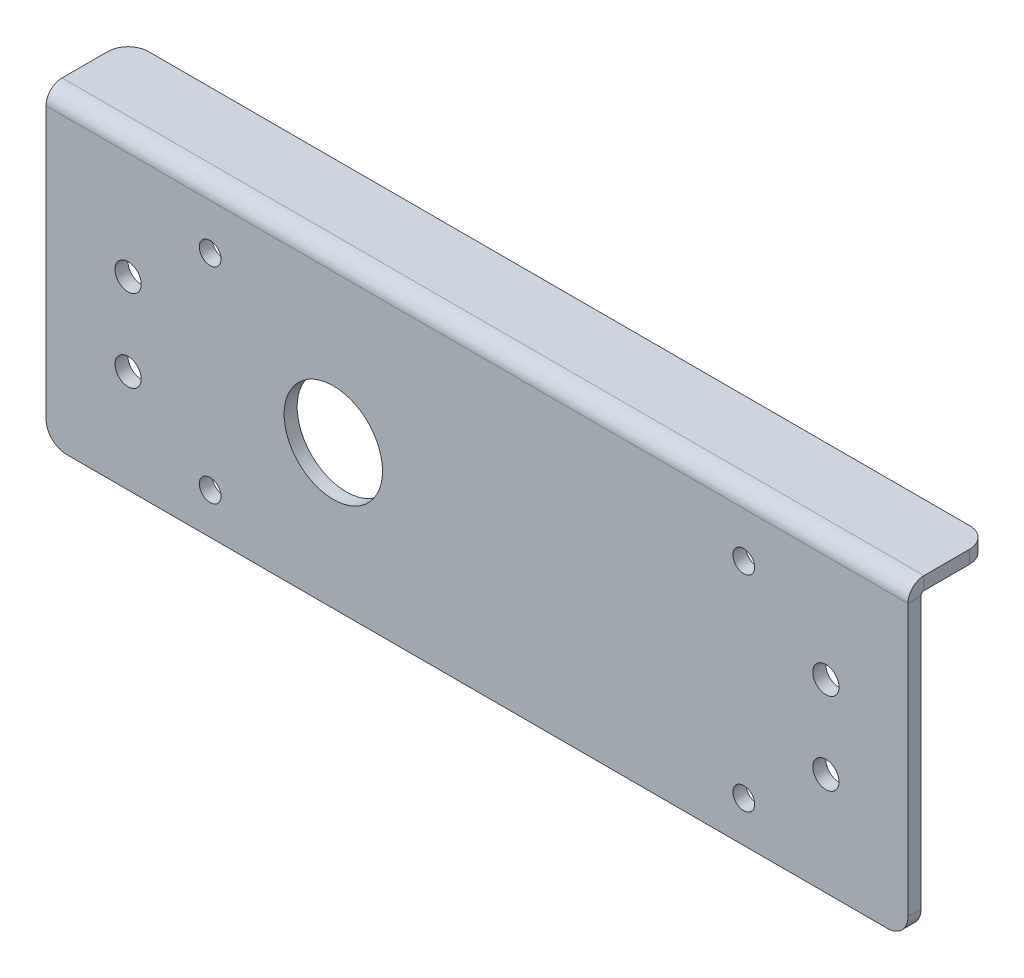
ISO-10303-21;
HEADER;
FILE_DESCRIPTION(('STEP AP214'),'2;1');
FILE_NAME('part.step','',(''),(''),'','','');
FILE_SCHEMA(('AUTOMOTIVE_DESIGN { 1 0 10303 214 1 1 1 1 }'));
ENDSEC;
DATA;
#1=APPLICATION_CONTEXT('core data for automotive mechanical design processes');
#2=APPLICATION_PROTOCOL_DEFINITION('international standard','automotive_design',2000,#1);
#3=PRODUCT_CONTEXT('',#1,'mechanical');
#4=PRODUCT('Part','Part','',(#3));
#5=PRODUCT_RELATED_PRODUCT_CATEGORY('part','',(#4));
#6=PRODUCT_DEFINITION_FORMATION('','',#4);
#7=PRODUCT_DEFINITION_CONTEXT('part definition',#1,'design');
#8=PRODUCT_DEFINITION('design','',#6,#7);
#9=PRODUCT_DEFINITION_SHAPE('','',#8);
#10=(LENGTH_UNIT() NAMED_UNIT(*) SI_UNIT(.MILLI.,.METRE.));
#11=(NAMED_UNIT(*) PLANE_ANGLE_UNIT() SI_UNIT($,.RADIAN.));
#12=(NAMED_UNIT(*) SI_UNIT($,.STERADIAN.) SOLID_ANGLE_UNIT());
#13=UNCERTAINTY_MEASURE_WITH_UNIT(LENGTH_MEASURE(1.E-05),#10,'distance_accuracy_value','');
#14=(GEOMETRIC_REPRESENTATION_CONTEXT(3) GLOBAL_UNCERTAINTY_ASSIGNED_CONTEXT((#13)) GLOBAL_UNIT_ASSIGNED_CONTEXT((#10,
#11,#12)) REPRESENTATION_CONTEXT('',''));
#15=CARTESIAN_POINT('',(0.,0.,0.));
#16=DIRECTION('',(0.,0.,1.));
#17=DIRECTION('',(1.,0.,0.));
#18=AXIS2_PLACEMENT_3D('',#15,#16,#17);
#19=CARTESIAN_POINT('',(140.,40.,-3.175));
#20=DIRECTION('',(1.,0.,0.));
#21=DIRECTION('',(0.,0.,-1.));
#22=AXIS2_PLACEMENT_3D('',#19,#20,#21);
#23=PLANE('',#22);
#24=DIRECTION('',(0.,1.,0.));
#25=VECTOR('',#24,1.);
#26=CARTESIAN_POINT('',(140.,40.,0.));
#27=LINE('',#26,#25);
#28=CARTESIAN_POINT('',(140.,-30.,0.));
#29=VERTEX_POINT('',#28);
#30=CARTESIAN_POINT('',(140.,36.0884,0.));
#31=VERTEX_POINT('',#30);
#32=EDGE_CURVE('E227',#29,#31,#27,.T.);
#33=ORIENTED_EDGE('',*,*,#32,.F.);
#34=DIRECTION('',(0.,0.,1.));
#35=VECTOR('',#34,1.);
#36=CARTESIAN_POINT('',(140.,-30.,-3.175));
#37=LINE('',#36,#35);
#38=CARTESIAN_POINT('',(140.,-30.,-3.175));
#39=VERTEX_POINT('',#38);
#40=EDGE_CURVE('E13',#29,#39,#37,.F.);
#41=ORIENTED_EDGE('',*,*,#40,.T.);
#42=DIRECTION('',(0.,1.,0.));
#43=VECTOR('',#42,1.);
#44=CARTESIAN_POINT('',(140.,40.,-3.175));
#45=LINE('',#44,#43);
#46=CARTESIAN_POINT('',(140.,36.0884,-3.175));
#47=VERTEX_POINT('',#46);
#48=EDGE_CURVE('E229',#39,#47,#45,.T.);
#49=ORIENTED_EDGE('',*,*,#48,.T.);
#50=DIRECTION('',(0.,0.,1.));
#51=VECTOR('',#50,1.);
#52=CARTESIAN_POINT('',(140.,36.0884,-3.175));
#53=LINE('',#52,#51);
#54=EDGE_CURVE('E205',#47,#31,#53,.T.);
#55=ORIENTED_EDGE('',*,*,#54,.T.);
#56=EDGE_LOOP('',(#33,#41,#49,#55));
#57=FACE_BOUND('',#56,.T.);
#58=ADVANCED_FACE('F59',(#57),#23,.T.);
#59=CARTESIAN_POINT('',(0.,0.,-3.175));
#60=DIRECTION('',(0.,0.,1.));
#61=DIRECTION('',(1.,0.,0.));
#62=AXIS2_PLACEMENT_3D('',#59,#60,#61);
#63=PLANE('',#62);
#64=CARTESIAN_POINT('',(-30.,25.,-3.175));
#65=DIRECTION('',(0.,0.,1.));
#66=DIRECTION('',(1.,0.,0.));
#67=AXIS2_PLACEMENT_3D('',#64,#65,#66);
#68=CIRCLE('',#67,2.65);
#69=CARTESIAN_POINT('',(-27.35,25.,-3.175));
#70=VERTEX_POINT('',#69);
#71=EDGE_CURVE('E349',#70,#70,#68,.T.);
#72=ORIENTED_EDGE('',*,*,#71,.T.);
#73=EDGE_LOOP('',(#72));
#74=FACE_BOUND('',#73,.T.);
#75=CARTESIAN_POINT('',(-30.,-25.,-3.175));
#76=DIRECTION('',(0.,0.,1.));
#77=DIRECTION('',(1.,0.,0.));
#78=AXIS2_PLACEMENT_3D('',#75,#76,#77);
#79=CIRCLE('',#78,2.65);
#80=CARTESIAN_POINT('',(-27.35,-25.,-3.175));
#81=VERTEX_POINT('',#80);
#82=EDGE_CURVE('E343',#81,#81,#79,.T.);
#83=ORIENTED_EDGE('',*,*,#82,.T.);
#84=EDGE_LOOP('',(#83));
#85=FACE_BOUND('',#84,.T.);
#86=CARTESIAN_POINT('',(100.,-25.,-3.175));
#87=DIRECTION('',(0.,0.,1.));
#88=DIRECTION('',(1.,0.,0.));
#89=AXIS2_PLACEMENT_3D('',#86,#87,#88);
#90=CIRCLE('',#89,2.65);
#91=CARTESIAN_POINT('',(102.65,-25.,-3.175));
#92=VERTEX_POINT('',#91);
#93=EDGE_CURVE('E337',#92,#92,#90,.T.);
#94=ORIENTED_EDGE('',*,*,#93,.T.);
#95=EDGE_LOOP('',(#94));
#96=FACE_BOUND('',#95,.T.);
#97=CARTESIAN_POINT('',(100.,25.,-3.175));
#98=DIRECTION('',(0.,0.,1.));
#99=DIRECTION('',(1.,0.,0.));
#100=AXIS2_PLACEMENT_3D('',#97,#98,#99);
#101=CIRCLE('',#100,2.65);
#102=CARTESIAN_POINT('',(102.65,25.,-3.175));
#103=VERTEX_POINT('',#102);
#104=EDGE_CURVE('E331',#103,#103,#101,.T.);
#105=ORIENTED_EDGE('',*,*,#104,.T.);
#106=EDGE_LOOP('',(#105));
#107=FACE_BOUND('',#106,.T.);
#108=CARTESIAN_POINT('',(-50.,10.,-3.175));
#109=DIRECTION('',(0.,0.,1.));
#110=DIRECTION('',(1.,0.,0.));
#111=AXIS2_PLACEMENT_3D('',#108,#109,#110);
#112=CIRCLE('',#111,3.19999999999999);
#113=CARTESIAN_POINT('',(-46.8,10.,-3.175));
#114=VERTEX_POINT('',#113);
#115=EDGE_CURVE('E325',#114,#114,#112,.T.);
#116=ORIENTED_EDGE('',*,*,#115,.T.);
#117=EDGE_LOOP('',(#116));
#118=FACE_BOUND('',#117,.T.);
#119=CARTESIAN_POINT('',(-50.,-10.,-3.175));
#120=DIRECTION('',(0.,0.,1.));
#121=DIRECTION('',(1.,0.,0.));
#122=AXIS2_PLACEMENT_3D('',#119,#120,#121);
#123=CIRCLE('',#122,3.19999999999999);
#124=CARTESIAN_POINT('',(-46.8,-10.,-3.175));
#125=VERTEX_POINT('',#124);
#126=EDGE_CURVE('E319',#125,#125,#123,.T.);
#127=ORIENTED_EDGE('',*,*,#126,.T.);
#128=EDGE_LOOP('',(#127));
#129=FACE_BOUND('',#128,.T.);
#130=CARTESIAN_POINT('',(120.,-10.,-3.175));
#131=DIRECTION('',(0.,0.,1.));
#132=DIRECTION('',(1.,0.,0.));
#133=AXIS2_PLACEMENT_3D('',#130,#131,#132);
#134=CIRCLE('',#133,3.19999999999999);
#135=CARTESIAN_POINT('',(123.2,-10.,-3.175));
#136=VERTEX_POINT('',#135);
#137=EDGE_CURVE('E313',#136,#136,#134,.T.);
#138=ORIENTED_EDGE('',*,*,#137,.T.);
#139=EDGE_LOOP('',(#138));
#140=FACE_BOUND('',#139,.T.);
#141=CARTESIAN_POINT('',(120.,10.,-3.175));
#142=DIRECTION('',(0.,0.,1.));
#143=DIRECTION('',(1.,0.,0.));
#144=AXIS2_PLACEMENT_3D('',#141,#142,#143);
#145=CIRCLE('',#144,3.19999999999999);
#146=CARTESIAN_POINT('',(123.2,10.,-3.175));
#147=VERTEX_POINT('',#146);
#148=EDGE_CURVE('E202',#147,#147,#145,.T.);
#149=ORIENTED_EDGE('',*,*,#148,.T.);
#150=EDGE_LOOP('',(#149));
#151=FACE_BOUND('',#150,.T.);
#152=CARTESIAN_POINT('',(0.,0.,-3.175));
#153=DIRECTION('',(0.,0.,1.));
#154=DIRECTION('',(1.,0.,0.));
#155=AXIS2_PLACEMENT_3D('',#152,#153,#154);
#156=CIRCLE('',#155,11.9875);
#157=CARTESIAN_POINT('',(11.9875,0.,-3.175));
#158=VERTEX_POINT('',#157);
#159=EDGE_CURVE('E217',#158,#158,#156,.T.);
#160=ORIENTED_EDGE('',*,*,#159,.T.);
#161=EDGE_LOOP('',(#160));
#162=FACE_BOUND('',#161,.T.);
#163=DIRECTION('',(1.,0.,0.));
#164=VECTOR('',#163,1.);
#165=CARTESIAN_POINT('',(-70.,-35.,-3.175));
#166=LINE('',#165,#164);
#167=CARTESIAN_POINT('',(-65.,-35.,-3.175));
#168=VERTEX_POINT('',#167);
#169=CARTESIAN_POINT('',(135.,-35.,-3.175));
#170=VERTEX_POINT('',#169);
#171=EDGE_CURVE('E226',#168,#170,#166,.T.);
#172=ORIENTED_EDGE('',*,*,#171,.F.);
#173=CARTESIAN_POINT('',(-65.,-30.,-3.175));
#174=DIRECTION('',(0.,0.,1.));
#175=DIRECTION('',(1.,0.,0.));
#176=AXIS2_PLACEMENT_3D('',#173,#174,#175);
#177=CIRCLE('',#176,5.);
#178=CARTESIAN_POINT('',(-70.,-30.,-3.175));
#179=VERTEX_POINT('',#178);
#180=EDGE_CURVE('E67',#168,#179,#177,.F.);
#181=ORIENTED_EDGE('',*,*,#180,.T.);
#182=DIRECTION('',(0.,-1.,0.));
#183=VECTOR('',#182,1.);
#184=CARTESIAN_POINT('',(-70.,40.,-3.175));
#185=LINE('',#184,#183);
#186=CARTESIAN_POINT('',(-70.,36.0884,-3.175));
#187=VERTEX_POINT('',#186);
#188=EDGE_CURVE('E223',#187,#179,#185,.T.);
#189=ORIENTED_EDGE('',*,*,#188,.F.);
#190=DIRECTION('',(1.,0.,0.));
#191=VECTOR('',#190,1.);
#192=CARTESIAN_POINT('',(140.,36.0884,-3.175));
#193=LINE('',#192,#191);
#194=EDGE_CURVE('E209',#47,#187,#193,.F.);
#195=ORIENTED_EDGE('',*,*,#194,.F.);
#196=ORIENTED_EDGE('',*,*,#48,.F.);
#197=CARTESIAN_POINT('',(135.,-30.,-3.175));
#198=DIRECTION('',(0.,0.,1.));
#199=DIRECTION('',(1.,0.,0.));
#200=AXIS2_PLACEMENT_3D('',#197,#198,#199);
#201=CIRCLE('',#200,5.);
#202=EDGE_CURVE('E79',#39,#170,#201,.F.);
#203=ORIENTED_EDGE('',*,*,#202,.T.);
#204=EDGE_LOOP('',(#172,#181,#189,#195,#196,#203));
#205=FACE_BOUND('',#204,.T.);
#206=ADVANCED_FACE('F268',(#74,#85,#96,#107,#118,#129,#140,#151,#162,#205),#63,.F.);
#207=CARTESIAN_POINT('',(0.,0.,0.));
#208=DIRECTION('',(0.,0.,1.));
#209=DIRECTION('',(1.,0.,0.));
#210=AXIS2_PLACEMENT_3D('',#207,#208,#209);
#211=PLANE('',#210);
#212=CARTESIAN_POINT('',(-30.,25.,0.));
#213=DIRECTION('',(0.,0.,1.));
#214=DIRECTION('',(1.,0.,0.));
#215=AXIS2_PLACEMENT_3D('',#212,#213,#214);
#216=CIRCLE('',#215,2.65);
#217=CARTESIAN_POINT('',(-27.35,25.,0.));
#218=VERTEX_POINT('',#217);
#219=EDGE_CURVE('E352',#218,#218,#216,.T.);
#220=ORIENTED_EDGE('',*,*,#219,.F.);
#221=EDGE_LOOP('',(#220));
#222=FACE_BOUND('',#221,.T.);
#223=CARTESIAN_POINT('',(-30.,-25.,0.));
#224=DIRECTION('',(0.,0.,1.));
#225=DIRECTION('',(1.,0.,0.));
#226=AXIS2_PLACEMENT_3D('',#223,#224,#225);
#227=CIRCLE('',#226,2.65);
#228=CARTESIAN_POINT('',(-27.35,-25.,0.));
#229=VERTEX_POINT('',#228);
#230=EDGE_CURVE('E346',#229,#229,#227,.T.);
#231=ORIENTED_EDGE('',*,*,#230,.F.);
#232=EDGE_LOOP('',(#231));
#233=FACE_BOUND('',#232,.T.);
#234=CARTESIAN_POINT('',(100.,-25.,0.));
#235=DIRECTION('',(0.,0.,1.));
#236=DIRECTION('',(1.,0.,0.));
#237=AXIS2_PLACEMENT_3D('',#234,#235,#236);
#238=CIRCLE('',#237,2.65);
#239=CARTESIAN_POINT('',(102.65,-25.,0.));
#240=VERTEX_POINT('',#239);
#241=EDGE_CURVE('E340',#240,#240,#238,.T.);
#242=ORIENTED_EDGE('',*,*,#241,.F.);
#243=EDGE_LOOP('',(#242));
#244=FACE_BOUND('',#243,.T.);
#245=CARTESIAN_POINT('',(100.,25.,0.));
#246=DIRECTION('',(0.,0.,1.));
#247=DIRECTION('',(1.,0.,0.));
#248=AXIS2_PLACEMENT_3D('',#245,#246,#247);
#249=CIRCLE('',#248,2.65);
#250=CARTESIAN_POINT('',(102.65,25.,0.));
#251=VERTEX_POINT('',#250);
#252=EDGE_CURVE('E334',#251,#251,#249,.T.);
#253=ORIENTED_EDGE('',*,*,#252,.F.);
#254=EDGE_LOOP('',(#253));
#255=FACE_BOUND('',#254,.T.);
#256=CARTESIAN_POINT('',(-50.,10.,0.));
#257=DIRECTION('',(0.,0.,1.));
#258=DIRECTION('',(1.,0.,0.));
#259=AXIS2_PLACEMENT_3D('',#256,#257,#258);
#260=CIRCLE('',#259,3.19999999999999);
#261=CARTESIAN_POINT('',(-46.8,10.,0.));
#262=VERTEX_POINT('',#261);
#263=EDGE_CURVE('E328',#262,#262,#260,.T.);
#264=ORIENTED_EDGE('',*,*,#263,.F.);
#265=EDGE_LOOP('',(#264));
#266=FACE_BOUND('',#265,.T.);
#267=CARTESIAN_POINT('',(-50.,-10.,0.));
#268=DIRECTION('',(0.,0.,1.));
#269=DIRECTION('',(1.,0.,0.));
#270=AXIS2_PLACEMENT_3D('',#267,#268,#269);
#271=CIRCLE('',#270,3.19999999999999);
#272=CARTESIAN_POINT('',(-46.8,-10.,0.));
#273=VERTEX_POINT('',#272);
#274=EDGE_CURVE('E322',#273,#273,#271,.T.);
#275=ORIENTED_EDGE('',*,*,#274,.F.);
#276=EDGE_LOOP('',(#275));
#277=FACE_BOUND('',#276,.T.);
#278=CARTESIAN_POINT('',(120.,-10.,0.));
#279=DIRECTION('',(0.,0.,1.));
#280=DIRECTION('',(1.,0.,0.));
#281=AXIS2_PLACEMENT_3D('',#278,#279,#280);
#282=CIRCLE('',#281,3.19999999999998);
#283=CARTESIAN_POINT('',(123.2,-10.,0.));
#284=VERTEX_POINT('',#283);
#285=EDGE_CURVE('E316',#284,#284,#282,.T.);
#286=ORIENTED_EDGE('',*,*,#285,.F.);
#287=EDGE_LOOP('',(#286));
#288=FACE_BOUND('',#287,.T.);
#289=CARTESIAN_POINT('',(120.,10.,0.));
#290=DIRECTION('',(0.,0.,1.));
#291=DIRECTION('',(1.,0.,0.));
#292=AXIS2_PLACEMENT_3D('',#289,#290,#291);
#293=CIRCLE('',#292,3.19999999999998);
#294=CARTESIAN_POINT('',(123.2,10.,0.));
#295=VERTEX_POINT('',#294);
#296=EDGE_CURVE('E310',#295,#295,#293,.T.);
#297=ORIENTED_EDGE('',*,*,#296,.F.);
#298=EDGE_LOOP('',(#297));
#299=FACE_BOUND('',#298,.T.);
#300=CARTESIAN_POINT('',(0.,0.,0.));
#301=DIRECTION('',(0.,0.,1.));
#302=DIRECTION('',(1.,0.,0.));
#303=AXIS2_PLACEMENT_3D('',#300,#301,#302);
#304=CIRCLE('',#303,11.9875);
#305=CARTESIAN_POINT('',(11.9875,0.,0.));
#306=VERTEX_POINT('',#305);
#307=EDGE_CURVE('E215',#306,#306,#304,.T.);
#308=ORIENTED_EDGE('',*,*,#307,.F.);
#309=EDGE_LOOP('',(#308));
#310=FACE_BOUND('',#309,.T.);
#311=DIRECTION('',(0.,-1.,0.));
#312=VECTOR('',#311,1.);
#313=CARTESIAN_POINT('',(-70.,40.,0.));
#314=LINE('',#313,#312);
#315=CARTESIAN_POINT('',(-70.,36.0884,0.));
#316=VERTEX_POINT('',#315);
#317=CARTESIAN_POINT('',(-70.,-30.,0.));
#318=VERTEX_POINT('',#317);
#319=EDGE_CURVE('E220',#316,#318,#314,.T.);
#320=ORIENTED_EDGE('',*,*,#319,.T.);
#321=CARTESIAN_POINT('',(-65.,-30.,0.));
#322=DIRECTION('',(0.,0.,1.));
#323=DIRECTION('',(1.,0.,0.));
#324=AXIS2_PLACEMENT_3D('',#321,#322,#323);
#325=CIRCLE('',#324,5.);
#326=CARTESIAN_POINT('',(-65.,-35.,0.));
#327=VERTEX_POINT('',#326);
#328=EDGE_CURVE('E259',#318,#327,#325,.T.);
#329=ORIENTED_EDGE('',*,*,#328,.T.);
#330=DIRECTION('',(1.,0.,0.));
#331=VECTOR('',#330,1.);
#332=CARTESIAN_POINT('',(-70.,-35.,0.));
#333=LINE('',#332,#331);
#334=CARTESIAN_POINT('',(135.,-35.,0.));
#335=VERTEX_POINT('',#334);
#336=EDGE_CURVE('E234',#327,#335,#333,.T.);
#337=ORIENTED_EDGE('',*,*,#336,.T.);
#338=CARTESIAN_POINT('',(135.,-30.,0.));
#339=DIRECTION('',(0.,0.,1.));
#340=DIRECTION('',(1.,0.,0.));
#341=AXIS2_PLACEMENT_3D('',#338,#339,#340);
#342=CIRCLE('',#341,5.);
#343=EDGE_CURVE('E257',#335,#29,#342,.T.);
#344=ORIENTED_EDGE('',*,*,#343,.T.);
#345=ORIENTED_EDGE('',*,*,#32,.T.);
#346=DIRECTION('',(1.,0.,0.));
#347=VECTOR('',#346,1.);
#348=CARTESIAN_POINT('',(140.,36.0884,0.));
#349=LINE('',#348,#347);
#350=EDGE_CURVE('E156',#31,#316,#349,.F.);
#351=ORIENTED_EDGE('',*,*,#350,.T.);
#352=EDGE_LOOP('',(#320,#329,#337,#344,#345,#351));
#353=FACE_BOUND('',#352,.T.);
#354=ADVANCED_FACE('F280',(#222,#233,#244,#255,#266,#277,#288,#299,#310,#353),#211,.T.);
#355=CARTESIAN_POINT('',(-70.,40.,-3.175));
#356=DIRECTION('',(-1.,0.,0.));
#357=DIRECTION('',(0.,-1.,0.));
#358=AXIS2_PLACEMENT_3D('',#355,#356,#357);
#359=PLANE('',#358);
#360=ORIENTED_EDGE('',*,*,#188,.T.);
#361=DIRECTION('',(0.,0.,1.));
#362=VECTOR('',#361,1.);
#363=CARTESIAN_POINT('',(-70.,-30.,-3.175));
#364=LINE('',#363,#362);
#365=EDGE_CURVE('E254',#179,#318,#364,.T.);
#366=ORIENTED_EDGE('',*,*,#365,.T.);
#367=ORIENTED_EDGE('',*,*,#319,.F.);
#368=DIRECTION('',(0.,0.,1.));
#369=VECTOR('',#368,1.);
#370=CARTESIAN_POINT('',(-70.,36.0884,-3.175));
#371=LINE('',#370,#369);
#372=EDGE_CURVE('E212',#187,#316,#371,.T.);
#373=ORIENTED_EDGE('',*,*,#372,.F.);
#374=EDGE_LOOP('',(#360,#366,#367,#373));
#375=FACE_BOUND('',#374,.T.);
#376=ADVANCED_FACE('F275',(#375),#359,.T.);
#377=CARTESIAN_POINT('',(-70.,-35.,-3.175));
#378=DIRECTION('',(0.,-1.,0.));
#379=DIRECTION('',(0.,0.,-1.));
#380=AXIS2_PLACEMENT_3D('',#377,#378,#379);
#381=PLANE('',#380);
#382=ORIENTED_EDGE('',*,*,#336,.F.);
#383=DIRECTION('',(0.,0.,1.));
#384=VECTOR('',#383,1.);
#385=CARTESIAN_POINT('',(-65.,-35.,-3.175));
#386=LINE('',#385,#384);
#387=EDGE_CURVE('E264',#327,#168,#386,.F.);
#388=ORIENTED_EDGE('',*,*,#387,.T.);
#389=ORIENTED_EDGE('',*,*,#171,.T.);
#390=DIRECTION('',(0.,0.,1.));
#391=VECTOR('',#390,1.);
#392=CARTESIAN_POINT('',(135.,-35.,-3.175));
#393=LINE('',#392,#391);
#394=EDGE_CURVE('E261',#170,#335,#393,.T.);
#395=ORIENTED_EDGE('',*,*,#394,.T.);
#396=EDGE_LOOP('',(#382,#388,#389,#395));
#397=FACE_BOUND('',#396,.T.);
#398=ADVANCED_FACE('F282',(#397),#381,.T.);
#399=CARTESIAN_POINT('',(0.,0.,-3.175));
#400=DIRECTION('',(0.,0.,1.));
#401=DIRECTION('',(1.,0.,0.));
#402=AXIS2_PLACEMENT_3D('',#399,#400,#401);
#403=CYLINDRICAL_SURFACE('',#402,11.9875);
#404=ORIENTED_EDGE('',*,*,#159,.F.);
#405=EDGE_LOOP('',(#404));
#406=FACE_BOUND('',#405,.T.);
#407=ORIENTED_EDGE('',*,*,#307,.T.);
#408=EDGE_LOOP('',(#407));
#409=FACE_BOUND('',#408,.T.);
#410=ADVANCED_FACE('F377',(#406,#409),#403,.F.);
#411=CARTESIAN_POINT('',(-70.,36.0884,-3.91159999999999));
#412=DIRECTION('',(-1.,0.,0.));
#413=DIRECTION('',(0.,0.,1.));
#414=AXIS2_PLACEMENT_3D('',#411,#412,#413);
#415=PLANE('',#414);
#416=DIRECTION('',(0.,-1.,0.));
#417=VECTOR('',#416,1.);
#418=CARTESIAN_POINT('',(-70.,40.,-3.91159999999998));
#419=LINE('',#418,#417);
#420=CARTESIAN_POINT('',(-70.,36.825,-3.91159999999999));
#421=VERTEX_POINT('',#420);
#422=CARTESIAN_POINT('',(-70.,40.,-3.91159999999998));
#423=VERTEX_POINT('',#422);
#424=EDGE_CURVE('E199',#421,#423,#419,.F.);
#425=ORIENTED_EDGE('',*,*,#424,.F.);
#426=CARTESIAN_POINT('',(-70.,36.0884,-3.91159999999999));
#427=DIRECTION('',(1.,0.,0.));
#428=DIRECTION('',(0.,0.,-1.));
#429=AXIS2_PLACEMENT_3D('',#426,#427,#428);
#430=CIRCLE('',#429,0.736599999999997);
#431=EDGE_CURVE('E160',#187,#421,#430,.F.);
#432=ORIENTED_EDGE('',*,*,#431,.F.);
#433=ORIENTED_EDGE('',*,*,#372,.T.);
#434=CARTESIAN_POINT('',(-70.,36.0884,-3.91159999999999));
#435=DIRECTION('',(1.,0.,0.));
#436=DIRECTION('',(0.,0.,-1.));
#437=AXIS2_PLACEMENT_3D('',#434,#435,#436);
#438=CIRCLE('',#437,3.9116);
#439=EDGE_CURVE('E204',#316,#423,#438,.F.);
#440=ORIENTED_EDGE('',*,*,#439,.T.);
#441=EDGE_LOOP('',(#425,#432,#433,#440));
#442=FACE_BOUND('',#441,.T.);
#443=ADVANCED_FACE('F379',(#442),#415,.T.);
#444=CARTESIAN_POINT('',(140.,36.0884,-3.91159999999999));
#445=DIRECTION('',(-1.,0.,0.));
#446=DIRECTION('',(0.,0.,1.));
#447=AXIS2_PLACEMENT_3D('',#444,#445,#446);
#448=PLANE('',#447);
#449=CARTESIAN_POINT('',(140.,36.0884,-3.91159999999999));
#450=DIRECTION('',(1.,0.,0.));
#451=DIRECTION('',(0.,0.,-1.));
#452=AXIS2_PLACEMENT_3D('',#449,#450,#451);
#453=CIRCLE('',#452,0.736599999999997);
#454=CARTESIAN_POINT('',(140.,36.825,-3.91159999999999));
#455=VERTEX_POINT('',#454);
#456=EDGE_CURVE('E167',#455,#47,#453,.T.);
#457=ORIENTED_EDGE('',*,*,#456,.F.);
#458=DIRECTION('',(0.,-1.,0.));
#459=VECTOR('',#458,1.);
#460=CARTESIAN_POINT('',(140.,36.825,-3.91159999999999));
#461=LINE('',#460,#459);
#462=CARTESIAN_POINT('',(140.,40.,-3.91159999999998));
#463=VERTEX_POINT('',#462);
#464=EDGE_CURVE('E164',#455,#463,#461,.F.);
#465=ORIENTED_EDGE('',*,*,#464,.T.);
#466=CARTESIAN_POINT('',(140.,36.0884,-3.91159999999999));
#467=DIRECTION('',(1.,0.,0.));
#468=DIRECTION('',(0.,0.,-1.));
#469=AXIS2_PLACEMENT_3D('',#466,#467,#468);
#470=CIRCLE('',#469,3.9116);
#471=EDGE_CURVE('E149',#463,#31,#470,.T.);
#472=ORIENTED_EDGE('',*,*,#471,.T.);
#473=ORIENTED_EDGE('',*,*,#54,.F.);
#474=EDGE_LOOP('',(#457,#465,#472,#473));
#475=FACE_BOUND('',#474,.T.);
#476=ADVANCED_FACE('F165',(#475),#448,.F.);
#477=CARTESIAN_POINT('',(140.,36.0884,-3.91159999999999));
#478=DIRECTION('',(1.,0.,0.));
#479=DIRECTION('',(0.,1.,0.));
#480=AXIS2_PLACEMENT_3D('',#477,#478,#479);
#481=CYLINDRICAL_SURFACE('',#480,3.9116);
#482=ORIENTED_EDGE('',*,*,#350,.F.);
#483=ORIENTED_EDGE('',*,*,#471,.F.);
#484=DIRECTION('',(1.,0.,0.));
#485=VECTOR('',#484,1.);
#486=CARTESIAN_POINT('',(-70.,40.,-3.91159999999998));
#487=LINE('',#486,#485);
#488=EDGE_CURVE('E153',#463,#423,#487,.F.);
#489=ORIENTED_EDGE('',*,*,#488,.T.);
#490=ORIENTED_EDGE('',*,*,#439,.F.);
#491=EDGE_LOOP('',(#482,#483,#489,#490));
#492=FACE_BOUND('',#491,.T.);
#493=ADVANCED_FACE('F151',(#492),#481,.T.);
#494=CARTESIAN_POINT('',(140.,36.0884,-3.91159999999999));
#495=DIRECTION('',(1.,0.,0.));
#496=DIRECTION('',(0.,1.,0.));
#497=AXIS2_PLACEMENT_3D('',#494,#495,#496);
#498=CYLINDRICAL_SURFACE('',#497,0.736599999999997);
#499=ORIENTED_EDGE('',*,*,#194,.T.);
#500=ORIENTED_EDGE('',*,*,#431,.T.);
#501=DIRECTION('',(1.,0.,0.));
#502=VECTOR('',#501,1.);
#503=CARTESIAN_POINT('',(-70.,36.825,-3.91159999999999));
#504=LINE('',#503,#502);
#505=EDGE_CURVE('E172',#421,#455,#504,.T.);
#506=ORIENTED_EDGE('',*,*,#505,.T.);
#507=ORIENTED_EDGE('',*,*,#456,.T.);
#508=EDGE_LOOP('',(#499,#500,#506,#507));
#509=FACE_BOUND('',#508,.T.);
#510=ADVANCED_FACE('F286',(#509),#498,.F.);
#511=CARTESIAN_POINT('',(140.,40.0000000000001,-20.));
#512=DIRECTION('',(-1.,0.,0.));
#513=DIRECTION('',(0.,0.,1.));
#514=AXIS2_PLACEMENT_3D('',#511,#512,#513);
#515=PLANE('',#514);
#516=DIRECTION('',(0.,0.,1.));
#517=VECTOR('',#516,1.);
#518=CARTESIAN_POINT('',(140.,36.8250000000001,-20.));
#519=LINE('',#518,#517);
#520=CARTESIAN_POINT('',(140.,36.825,-15.));
#521=VERTEX_POINT('',#520);
#522=EDGE_CURVE('E181',#455,#521,#519,.F.);
#523=ORIENTED_EDGE('',*,*,#522,.T.);
#524=DIRECTION('',(0.,-1.,0.));
#525=VECTOR('',#524,1.);
#526=CARTESIAN_POINT('',(140.,40.,-15.));
#527=LINE('',#526,#525);
#528=CARTESIAN_POINT('',(140.,40.,-15.));
#529=VERTEX_POINT('',#528);
#530=EDGE_CURVE('E185',#521,#529,#527,.F.);
#531=ORIENTED_EDGE('',*,*,#530,.T.);
#532=DIRECTION('',(0.,0.,-1.));
#533=VECTOR('',#532,1.);
#534=CARTESIAN_POINT('',(140.,40.,1.43058472522762E-13));
#535=LINE('',#534,#533);
#536=EDGE_CURVE('E177',#463,#529,#535,.T.);
#537=ORIENTED_EDGE('',*,*,#536,.F.);
#538=ORIENTED_EDGE('',*,*,#464,.F.);
#539=EDGE_LOOP('',(#523,#531,#537,#538));
#540=FACE_BOUND('',#539,.T.);
#541=ADVANCED_FACE('F183',(#540),#515,.F.);
#542=CARTESIAN_POINT('',(-70.,40.,-3.17499999999999));
#543=DIRECTION('',(1.,0.,0.));
#544=DIRECTION('',(0.,0.,-1.));
#545=AXIS2_PLACEMENT_3D('',#542,#543,#544);
#546=PLANE('',#545);
#547=DIRECTION('',(0.,0.,1.));
#548=VECTOR('',#547,1.);
#549=CARTESIAN_POINT('',(-70.,40.,1.43058472522762E-13));
#550=LINE('',#549,#548);
#551=CARTESIAN_POINT('',(-70.,40.,-15.));
#552=VERTEX_POINT('',#551);
#553=EDGE_CURVE('E180',#552,#423,#550,.T.);
#554=ORIENTED_EDGE('',*,*,#553,.F.);
#555=DIRECTION('',(0.,-1.,0.));
#556=VECTOR('',#555,1.);
#557=CARTESIAN_POINT('',(-70.,40.,-15.));
#558=LINE('',#557,#556);
#559=CARTESIAN_POINT('',(-70.,36.825,-15.));
#560=VERTEX_POINT('',#559);
#561=EDGE_CURVE('E251',#552,#560,#558,.T.);
#562=ORIENTED_EDGE('',*,*,#561,.T.);
#563=DIRECTION('',(0.,0.,-1.));
#564=VECTOR('',#563,1.);
#565=CARTESIAN_POINT('',(-70.,36.825,-3.175));
#566=LINE('',#565,#564);
#567=EDGE_CURVE('E187',#560,#421,#566,.F.);
#568=ORIENTED_EDGE('',*,*,#567,.T.);
#569=ORIENTED_EDGE('',*,*,#424,.T.);
#570=EDGE_LOOP('',(#554,#562,#568,#569));
#571=FACE_BOUND('',#570,.T.);
#572=ADVANCED_FACE('F305',(#571),#546,.F.);
#573=CARTESIAN_POINT('',(0.,40.,1.43058472522762E-13));
#574=DIRECTION('',(0.,-1.,0.));
#575=DIRECTION('',(0.,0.,-1.));
#576=AXIS2_PLACEMENT_3D('',#573,#574,#575);
#577=PLANE('',#576);
#578=ORIENTED_EDGE('',*,*,#536,.T.);
#579=CARTESIAN_POINT('',(135.,40.,-15.));
#580=DIRECTION('',(0.,-1.,0.));
#581=DIRECTION('',(0.,0.,-1.));
#582=AXIS2_PLACEMENT_3D('',#579,#580,#581);
#583=CIRCLE('',#582,5.);
#584=CARTESIAN_POINT('',(135.,40.0000000000001,-20.));
#585=VERTEX_POINT('',#584);
#586=EDGE_CURVE('E249',#529,#585,#583,.F.);
#587=ORIENTED_EDGE('',*,*,#586,.T.);
#588=DIRECTION('',(-1.,0.,0.));
#589=VECTOR('',#588,1.);
#590=CARTESIAN_POINT('',(0.,40.0000000000001,-20.));
#591=LINE('',#590,#589);
#592=CARTESIAN_POINT('',(-65.,40.0000000000001,-20.));
#593=VERTEX_POINT('',#592);
#594=EDGE_CURVE('E186',#585,#593,#591,.T.);
#595=ORIENTED_EDGE('',*,*,#594,.T.);
#596=CARTESIAN_POINT('',(-65.,40.,-15.));
#597=DIRECTION('',(0.,-1.,0.));
#598=DIRECTION('',(0.,0.,-1.));
#599=AXIS2_PLACEMENT_3D('',#596,#597,#598);
#600=CIRCLE('',#599,5.);
#601=EDGE_CURVE('E247',#593,#552,#600,.F.);
#602=ORIENTED_EDGE('',*,*,#601,.T.);
#603=ORIENTED_EDGE('',*,*,#553,.T.);
#604=ORIENTED_EDGE('',*,*,#488,.F.);
#605=EDGE_LOOP('',(#578,#587,#595,#602,#603,#604));
#606=FACE_BOUND('',#605,.T.);
#607=ADVANCED_FACE('F176',(#606),#577,.F.);
#608=CARTESIAN_POINT('',(0.,36.825,1.31973019271935E-13));
#609=DIRECTION('',(0.,-1.,0.));
#610=DIRECTION('',(0.,0.,-1.));
#611=AXIS2_PLACEMENT_3D('',#608,#609,#610);
#612=PLANE('',#611);
#613=DIRECTION('',(1.,0.,0.));
#614=VECTOR('',#613,1.);
#615=CARTESIAN_POINT('',(-70.,36.8250000000001,-20.));
#616=LINE('',#615,#614);
#617=CARTESIAN_POINT('',(135.,36.8250000000001,-20.));
#618=VERTEX_POINT('',#617);
#619=CARTESIAN_POINT('',(-65.,36.8250000000001,-20.));
#620=VERTEX_POINT('',#619);
#621=EDGE_CURVE('E191',#618,#620,#616,.F.);
#622=ORIENTED_EDGE('',*,*,#621,.F.);
#623=CARTESIAN_POINT('',(135.,36.825,-15.));
#624=DIRECTION('',(0.,-1.,0.));
#625=DIRECTION('',(0.,0.,-1.));
#626=AXIS2_PLACEMENT_3D('',#623,#624,#625);
#627=CIRCLE('',#626,5.);
#628=EDGE_CURVE('E244',#618,#521,#627,.T.);
#629=ORIENTED_EDGE('',*,*,#628,.T.);
#630=ORIENTED_EDGE('',*,*,#522,.F.);
#631=ORIENTED_EDGE('',*,*,#505,.F.);
#632=ORIENTED_EDGE('',*,*,#567,.F.);
#633=CARTESIAN_POINT('',(-65.,36.825,-15.));
#634=DIRECTION('',(0.,-1.,0.));
#635=DIRECTION('',(0.,0.,-1.));
#636=AXIS2_PLACEMENT_3D('',#633,#634,#635);
#637=CIRCLE('',#636,5.);
#638=EDGE_CURVE('E242',#560,#620,#637,.T.);
#639=ORIENTED_EDGE('',*,*,#638,.T.);
#640=EDGE_LOOP('',(#622,#629,#630,#631,#632,#639));
#641=FACE_BOUND('',#640,.T.);
#642=ADVANCED_FACE('F292',(#641),#612,.T.);
#643=CARTESIAN_POINT('',(-70.,40.0000000000001,-20.));
#644=DIRECTION('',(0.,0.,1.));
#645=DIRECTION('',(0.,-1.,0.));
#646=AXIS2_PLACEMENT_3D('',#643,#644,#645);
#647=PLANE('',#646);
#648=ORIENTED_EDGE('',*,*,#594,.F.);
#649=DIRECTION('',(0.,-1.,0.));
#650=VECTOR('',#649,1.);
#651=CARTESIAN_POINT('',(135.,40.0000000000001,-20.));
#652=LINE('',#651,#650);
#653=EDGE_CURVE('E239',#585,#618,#652,.T.);
#654=ORIENTED_EDGE('',*,*,#653,.T.);
#655=ORIENTED_EDGE('',*,*,#621,.T.);
#656=DIRECTION('',(0.,-1.,0.));
#657=VECTOR('',#656,1.);
#658=CARTESIAN_POINT('',(-65.,40.0000000000001,-20.));
#659=LINE('',#658,#657);
#660=EDGE_CURVE('E231',#620,#593,#659,.F.);
#661=ORIENTED_EDGE('',*,*,#660,.T.);
#662=EDGE_LOOP('',(#648,#654,#655,#661));
#663=FACE_BOUND('',#662,.T.);
#664=ADVANCED_FACE('F299',(#663),#647,.F.);
#665=CARTESIAN_POINT('',(120.,10.,0.));
#666=DIRECTION('',(0.,0.,1.));
#667=DIRECTION('',(1.,0.,0.));
#668=AXIS2_PLACEMENT_3D('',#665,#666,#667);
#669=CYLINDRICAL_SURFACE('',#668,3.19999999999999);
#670=ORIENTED_EDGE('',*,*,#148,.F.);
#671=EDGE_LOOP('',(#670));
#672=FACE_BOUND('',#671,.T.);
#673=ORIENTED_EDGE('',*,*,#296,.T.);
#674=EDGE_LOOP('',(#673));
#675=FACE_BOUND('',#674,.T.);
#676=ADVANCED_FACE('F437',(#672,#675),#669,.F.);
#677=CARTESIAN_POINT('',(120.,-10.,0.));
#678=DIRECTION('',(0.,0.,1.));
#679=DIRECTION('',(1.,0.,0.));
#680=AXIS2_PLACEMENT_3D('',#677,#678,#679);
#681=CYLINDRICAL_SURFACE('',#680,3.19999999999999);
#682=ORIENTED_EDGE('',*,*,#137,.F.);
#683=EDGE_LOOP('',(#682));
#684=FACE_BOUND('',#683,.T.);
#685=ORIENTED_EDGE('',*,*,#285,.T.);
#686=EDGE_LOOP('',(#685));
#687=FACE_BOUND('',#686,.T.);
#688=ADVANCED_FACE('F568',(#684,#687),#681,.F.);
#689=CARTESIAN_POINT('',(-50.,-10.,0.));
#690=DIRECTION('',(0.,0.,1.));
#691=DIRECTION('',(1.,0.,0.));
#692=AXIS2_PLACEMENT_3D('',#689,#690,#691);
#693=CYLINDRICAL_SURFACE('',#692,3.19999999999999);
#694=ORIENTED_EDGE('',*,*,#126,.F.);
#695=EDGE_LOOP('',(#694));
#696=FACE_BOUND('',#695,.T.);
#697=ORIENTED_EDGE('',*,*,#274,.T.);
#698=EDGE_LOOP('',(#697));
#699=FACE_BOUND('',#698,.T.);
#700=ADVANCED_FACE('F558',(#696,#699),#693,.F.);
#701=CARTESIAN_POINT('',(-50.,10.,0.));
#702=DIRECTION('',(0.,0.,1.));
#703=DIRECTION('',(1.,0.,0.));
#704=AXIS2_PLACEMENT_3D('',#701,#702,#703);
#705=CYLINDRICAL_SURFACE('',#704,3.19999999999999);
#706=ORIENTED_EDGE('',*,*,#115,.F.);
#707=EDGE_LOOP('',(#706));
#708=FACE_BOUND('',#707,.T.);
#709=ORIENTED_EDGE('',*,*,#263,.T.);
#710=EDGE_LOOP('',(#709));
#711=FACE_BOUND('',#710,.T.);
#712=ADVANCED_FACE('F548',(#708,#711),#705,.F.);
#713=CARTESIAN_POINT('',(100.,25.,0.));
#714=DIRECTION('',(0.,0.,1.));
#715=DIRECTION('',(1.,0.,0.));
#716=AXIS2_PLACEMENT_3D('',#713,#714,#715);
#717=CYLINDRICAL_SURFACE('',#716,2.65);
#718=ORIENTED_EDGE('',*,*,#104,.F.);
#719=EDGE_LOOP('',(#718));
#720=FACE_BOUND('',#719,.T.);
#721=ORIENTED_EDGE('',*,*,#252,.T.);
#722=EDGE_LOOP('',(#721));
#723=FACE_BOUND('',#722,.T.);
#724=ADVANCED_FACE('F538',(#720,#723),#717,.F.);
#725=CARTESIAN_POINT('',(100.,-25.,0.));
#726=DIRECTION('',(0.,0.,1.));
#727=DIRECTION('',(1.,0.,0.));
#728=AXIS2_PLACEMENT_3D('',#725,#726,#727);
#729=CYLINDRICAL_SURFACE('',#728,2.65);
#730=ORIENTED_EDGE('',*,*,#93,.F.);
#731=EDGE_LOOP('',(#730));
#732=FACE_BOUND('',#731,.T.);
#733=ORIENTED_EDGE('',*,*,#241,.T.);
#734=EDGE_LOOP('',(#733));
#735=FACE_BOUND('',#734,.T.);
#736=ADVANCED_FACE('F528',(#732,#735),#729,.F.);
#737=CARTESIAN_POINT('',(-30.,-25.,0.));
#738=DIRECTION('',(0.,0.,1.));
#739=DIRECTION('',(1.,0.,0.));
#740=AXIS2_PLACEMENT_3D('',#737,#738,#739);
#741=CYLINDRICAL_SURFACE('',#740,2.65);
#742=ORIENTED_EDGE('',*,*,#82,.F.);
#743=EDGE_LOOP('',(#742));
#744=FACE_BOUND('',#743,.T.);
#745=ORIENTED_EDGE('',*,*,#230,.T.);
#746=EDGE_LOOP('',(#745));
#747=FACE_BOUND('',#746,.T.);
#748=ADVANCED_FACE('F518',(#744,#747),#741,.F.);
#749=CARTESIAN_POINT('',(-30.,25.,0.));
#750=DIRECTION('',(0.,0.,1.));
#751=DIRECTION('',(1.,0.,0.));
#752=AXIS2_PLACEMENT_3D('',#749,#750,#751);
#753=CYLINDRICAL_SURFACE('',#752,2.65);
#754=ORIENTED_EDGE('',*,*,#71,.F.);
#755=EDGE_LOOP('',(#754));
#756=FACE_BOUND('',#755,.T.);
#757=ORIENTED_EDGE('',*,*,#219,.T.);
#758=EDGE_LOOP('',(#757));
#759=FACE_BOUND('',#758,.T.);
#760=ADVANCED_FACE('F356',(#756,#759),#753,.F.);
#761=CARTESIAN_POINT('',(135.,40.,-15.));
#762=DIRECTION('',(0.,-1.,0.));
#763=DIRECTION('',(0.,0.,-1.));
#764=AXIS2_PLACEMENT_3D('',#761,#762,#763);
#765=CYLINDRICAL_SURFACE('',#764,5.);
#766=ORIENTED_EDGE('',*,*,#586,.F.);
#767=ORIENTED_EDGE('',*,*,#530,.F.);
#768=ORIENTED_EDGE('',*,*,#628,.F.);
#769=ORIENTED_EDGE('',*,*,#653,.F.);
#770=EDGE_LOOP('',(#766,#767,#768,#769));
#771=FACE_BOUND('',#770,.T.);
#772=ADVANCED_FACE('F294',(#771),#765,.T.);
#773=CARTESIAN_POINT('',(-65.,40.,-15.));
#774=DIRECTION('',(0.,-1.,0.));
#775=DIRECTION('',(0.,0.,-1.));
#776=AXIS2_PLACEMENT_3D('',#773,#774,#775);
#777=CYLINDRICAL_SURFACE('',#776,5.);
#778=ORIENTED_EDGE('',*,*,#601,.F.);
#779=ORIENTED_EDGE('',*,*,#660,.F.);
#780=ORIENTED_EDGE('',*,*,#638,.F.);
#781=ORIENTED_EDGE('',*,*,#561,.F.);
#782=EDGE_LOOP('',(#778,#779,#780,#781));
#783=FACE_BOUND('',#782,.T.);
#784=ADVANCED_FACE('F302',(#783),#777,.T.);
#785=CARTESIAN_POINT('',(-65.,-30.,-3.175));
#786=DIRECTION('',(0.,0.,1.));
#787=DIRECTION('',(1.,0.,0.));
#788=AXIS2_PLACEMENT_3D('',#785,#786,#787);
#789=CYLINDRICAL_SURFACE('',#788,5.);
#790=ORIENTED_EDGE('',*,*,#180,.F.);
#791=ORIENTED_EDGE('',*,*,#387,.F.);
#792=ORIENTED_EDGE('',*,*,#328,.F.);
#793=ORIENTED_EDGE('',*,*,#365,.F.);
#794=EDGE_LOOP('',(#790,#791,#792,#793));
#795=FACE_BOUND('',#794,.T.);
#796=ADVANCED_FACE('F277',(#795),#789,.T.);
#797=CARTESIAN_POINT('',(135.,-30.,-3.175));
#798=DIRECTION('',(0.,0.,1.));
#799=DIRECTION('',(1.,0.,0.));
#800=AXIS2_PLACEMENT_3D('',#797,#798,#799);
#801=CYLINDRICAL_SURFACE('',#800,5.);
#802=ORIENTED_EDGE('',*,*,#202,.F.);
#803=ORIENTED_EDGE('',*,*,#40,.F.);
#804=ORIENTED_EDGE('',*,*,#343,.F.);
#805=ORIENTED_EDGE('',*,*,#394,.F.);
#806=EDGE_LOOP('',(#802,#803,#804,#805));
#807=FACE_BOUND('',#806,.T.);
#808=ADVANCED_FACE('F61',(#807),#801,.T.);
#809=CLOSED_SHELL('',(#58,#206,#354,#376,#398,#410,#443,#476,#493,#510,#541,#572,#607,#642,#664,
#676,#688,#700,#712,#724,#736,#748,#760,#772,#784,#796,#808));
#810=MANIFOLD_SOLID_BREP('B2',#809);
#811=ADVANCED_BREP_SHAPE_REPRESENTATION('',(#18,#810),#14);
#812=SHAPE_DEFINITION_REPRESENTATION(#9,#811);
ENDSEC;
END-ISO-10303-21;
